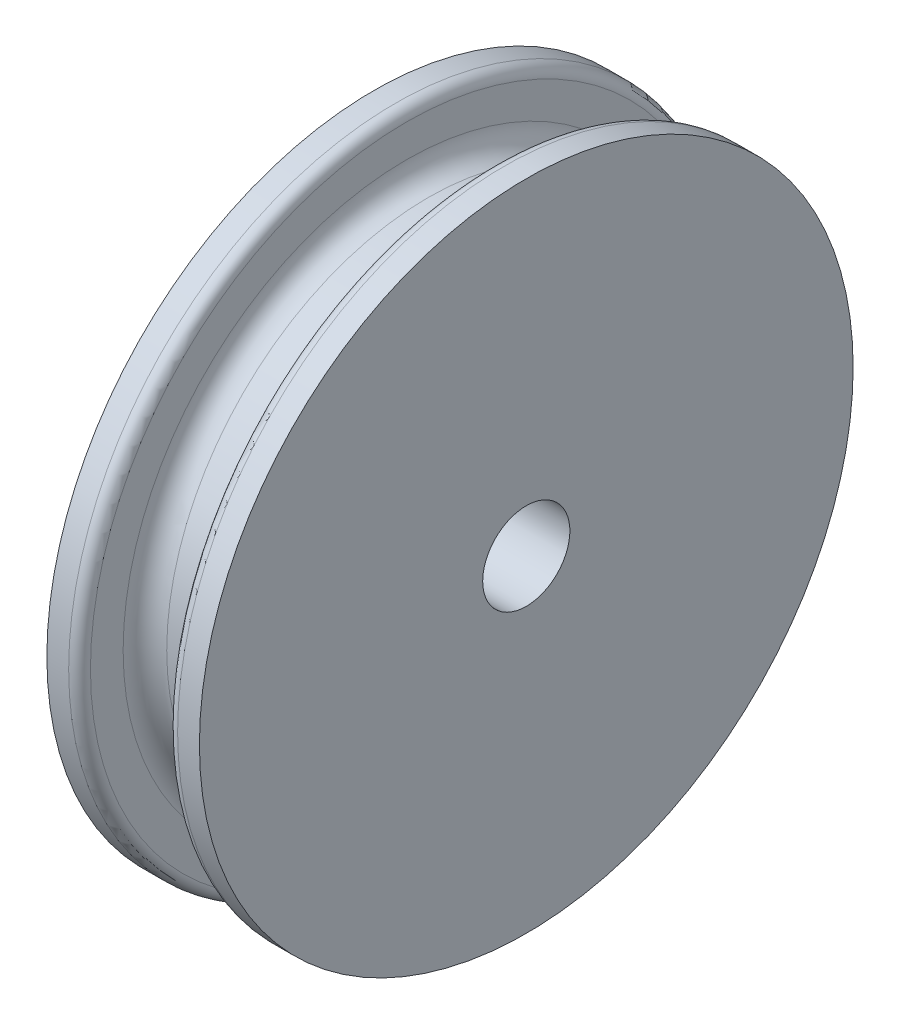
ISO-10303-21;
HEADER;
FILE_DESCRIPTION(('STEP AP214'),'2;1');
FILE_NAME('part.step','',(''),(''),'','','');
FILE_SCHEMA(('AUTOMOTIVE_DESIGN { 1 0 10303 214 1 1 1 1 }'));
ENDSEC;
DATA;
#1=APPLICATION_CONTEXT('core data for automotive mechanical design processes');
#2=APPLICATION_PROTOCOL_DEFINITION('international standard','automotive_design',2000,#1);
#3=PRODUCT_CONTEXT('',#1,'mechanical');
#4=PRODUCT('Part','Part','',(#3));
#5=PRODUCT_RELATED_PRODUCT_CATEGORY('part','',(#4));
#6=PRODUCT_DEFINITION_FORMATION('','',#4);
#7=PRODUCT_DEFINITION_CONTEXT('part definition',#1,'design');
#8=PRODUCT_DEFINITION('design','',#6,#7);
#9=PRODUCT_DEFINITION_SHAPE('','',#8);
#10=(LENGTH_UNIT() NAMED_UNIT(*) SI_UNIT(.MILLI.,.METRE.));
#11=(NAMED_UNIT(*) PLANE_ANGLE_UNIT() SI_UNIT($,.RADIAN.));
#12=(NAMED_UNIT(*) SI_UNIT($,.STERADIAN.) SOLID_ANGLE_UNIT());
#13=UNCERTAINTY_MEASURE_WITH_UNIT(LENGTH_MEASURE(1.E-05),#10,'distance_accuracy_value','');
#14=(GEOMETRIC_REPRESENTATION_CONTEXT(3) GLOBAL_UNCERTAINTY_ASSIGNED_CONTEXT((#13)) GLOBAL_UNIT_ASSIGNED_CONTEXT((#10,
#11,#12)) REPRESENTATION_CONTEXT('',''));
#15=CARTESIAN_POINT('',(0.,0.,0.));
#16=DIRECTION('',(0.,0.,1.));
#17=DIRECTION('',(1.,0.,0.));
#18=AXIS2_PLACEMENT_3D('',#15,#16,#17);
#19=CARTESIAN_POINT('',(1.75,1.,0.));
#20=DIRECTION('',(-1.,0.,0.));
#21=DIRECTION('',(0.,0.,1.));
#22=AXIS2_PLACEMENT_3D('',#19,#20,#21);
#23=PLANE('',#22);
#24=CARTESIAN_POINT('',(1.75,0.,0.));
#25=DIRECTION('',(-1.,0.,0.));
#26=DIRECTION('',(0.,0.,1.));
#27=AXIS2_PLACEMENT_3D('',#24,#25,#26);
#28=CIRCLE('',#27,7.5);
#29=CARTESIAN_POINT('',(1.75,0.,7.5));
#30=VERTEX_POINT('',#29);
#31=EDGE_CURVE('E73',#30,#30,#28,.T.);
#32=ORIENTED_EDGE('',*,*,#31,.F.);
#33=EDGE_LOOP('',(#32));
#34=FACE_BOUND('',#33,.T.);
#35=CARTESIAN_POINT('',(1.75,0.,0.));
#36=DIRECTION('',(-1.,0.,0.));
#37=DIRECTION('',(0.,0.,1.));
#38=AXIS2_PLACEMENT_3D('',#35,#36,#37);
#39=CIRCLE('',#38,1.);
#40=CARTESIAN_POINT('',(1.75,0.,1.));
#41=VERTEX_POINT('',#40);
#42=EDGE_CURVE('E52',#41,#41,#39,.T.);
#43=ORIENTED_EDGE('',*,*,#42,.T.);
#44=EDGE_LOOP('',(#43));
#45=FACE_BOUND('',#44,.T.);
#46=ADVANCED_FACE('F32',(#34,#45),#23,.F.);
#47=CARTESIAN_POINT('',(0.,0.,0.));
#48=DIRECTION('',(-1.,0.,0.));
#49=DIRECTION('',(0.,0.,1.));
#50=AXIS2_PLACEMENT_3D('',#47,#48,#49);
#51=CYLINDRICAL_SURFACE('',#50,1.);
#52=ORIENTED_EDGE('',*,*,#42,.F.);
#53=EDGE_LOOP('',(#52));
#54=FACE_BOUND('',#53,.T.);
#55=CARTESIAN_POINT('',(-1.75,0.,0.));
#56=DIRECTION('',(-1.,0.,0.));
#57=DIRECTION('',(0.,0.,1.));
#58=AXIS2_PLACEMENT_3D('',#55,#56,#57);
#59=CIRCLE('',#58,1.);
#60=CARTESIAN_POINT('',(-1.75,0.,1.));
#61=VERTEX_POINT('',#60);
#62=EDGE_CURVE('E55',#61,#61,#59,.T.);
#63=ORIENTED_EDGE('',*,*,#62,.T.);
#64=EDGE_LOOP('',(#63));
#65=FACE_BOUND('',#64,.T.);
#66=ADVANCED_FACE('F81',(#54,#65),#51,.F.);
#67=CARTESIAN_POINT('',(-1.75,1.,0.));
#68=DIRECTION('',(1.,0.,0.));
#69=DIRECTION('',(0.,0.,-1.));
#70=AXIS2_PLACEMENT_3D('',#67,#68,#69);
#71=PLANE('',#70);
#72=ORIENTED_EDGE('',*,*,#62,.F.);
#73=EDGE_LOOP('',(#72));
#74=FACE_BOUND('',#73,.T.);
#75=CARTESIAN_POINT('',(-1.75,0.,0.));
#76=DIRECTION('',(-1.,0.,0.));
#77=DIRECTION('',(0.,0.,1.));
#78=AXIS2_PLACEMENT_3D('',#75,#76,#77);
#79=CIRCLE('',#78,7.5);
#80=CARTESIAN_POINT('',(-1.75,0.,7.5));
#81=VERTEX_POINT('',#80);
#82=EDGE_CURVE('E58',#81,#81,#79,.T.);
#83=ORIENTED_EDGE('',*,*,#82,.T.);
#84=EDGE_LOOP('',(#83));
#85=FACE_BOUND('',#84,.T.);
#86=ADVANCED_FACE('F87',(#74,#85),#71,.F.);
#87=CARTESIAN_POINT('',(0.,0.,0.));
#88=DIRECTION('',(-1.,0.,0.));
#89=DIRECTION('',(0.,0.,1.));
#90=AXIS2_PLACEMENT_3D('',#87,#88,#89);
#91=CYLINDRICAL_SURFACE('',#90,7.5);
#92=CARTESIAN_POINT('',(-1.25,0.,0.));
#93=DIRECTION('',(-1.,0.,0.));
#94=DIRECTION('',(0.,0.,1.));
#95=AXIS2_PLACEMENT_3D('',#92,#93,#94);
#96=CIRCLE('',#95,7.5);
#97=CARTESIAN_POINT('',(-1.25,0.,7.5));
#98=VERTEX_POINT('',#97);
#99=EDGE_CURVE('E47',#98,#98,#96,.T.);
#100=ORIENTED_EDGE('',*,*,#99,.T.);
#101=EDGE_LOOP('',(#100));
#102=FACE_BOUND('',#101,.T.);
#103=ORIENTED_EDGE('',*,*,#82,.F.);
#104=EDGE_LOOP('',(#103));
#105=FACE_BOUND('',#104,.T.);
#106=ADVANCED_FACE('F93',(#102,#105),#91,.T.);
#107=CARTESIAN_POINT('',(-0.999999999999999,7.5,0.));
#108=DIRECTION('',(-1.,0.,0.));
#109=DIRECTION('',(0.,0.,1.));
#110=AXIS2_PLACEMENT_3D('',#107,#108,#109);
#111=PLANE('',#110);
#112=CARTESIAN_POINT('',(-0.999999999999999,0.,0.));
#113=DIRECTION('',(-1.,0.,0.));
#114=DIRECTION('',(0.,0.,1.));
#115=AXIS2_PLACEMENT_3D('',#112,#113,#114);
#116=CIRCLE('',#115,7.25);
#117=CARTESIAN_POINT('',(-0.999999999999999,0.,7.25));
#118=VERTEX_POINT('',#117);
#119=EDGE_CURVE('E43',#118,#118,#116,.F.);
#120=ORIENTED_EDGE('',*,*,#119,.T.);
#121=EDGE_LOOP('',(#120));
#122=FACE_BOUND('',#121,.T.);
#123=CARTESIAN_POINT('',(-0.999999999999999,0.,0.));
#124=DIRECTION('',(-1.,0.,0.));
#125=DIRECTION('',(0.,0.,1.));
#126=AXIS2_PLACEMENT_3D('',#123,#124,#125);
#127=CIRCLE('',#126,6.5);
#128=CARTESIAN_POINT('',(-0.999999999999999,0.,6.5));
#129=VERTEX_POINT('',#128);
#130=EDGE_CURVE('E61',#129,#129,#127,.T.);
#131=ORIENTED_EDGE('',*,*,#130,.T.);
#132=EDGE_LOOP('',(#131));
#133=FACE_BOUND('',#132,.T.);
#134=ADVANCED_FACE('F98',(#122,#133),#111,.F.);
#135=CARTESIAN_POINT('',(-0.499999999999999,0.,0.));
#136=DIRECTION('',(-1.,0.,0.));
#137=DIRECTION('',(0.,0.,1.));
#138=AXIS2_PLACEMENT_3D('',#135,#136,#137);
#139=TOROIDAL_SURFACE('',#138,6.5,0.5);
#140=ORIENTED_EDGE('',*,*,#130,.F.);
#141=EDGE_LOOP('',(#140));
#142=FACE_BOUND('',#141,.T.);
#143=CARTESIAN_POINT('',(-0.5,0.,0.));
#144=DIRECTION('',(-1.,0.,0.));
#145=DIRECTION('',(0.,0.,1.));
#146=AXIS2_PLACEMENT_3D('',#143,#144,#145);
#147=CIRCLE('',#146,6.);
#148=CARTESIAN_POINT('',(-0.5,0.,6.));
#149=VERTEX_POINT('',#148);
#150=EDGE_CURVE('E64',#149,#149,#147,.T.);
#151=ORIENTED_EDGE('',*,*,#150,.T.);
#152=EDGE_LOOP('',(#151));
#153=FACE_BOUND('',#152,.T.);
#154=ADVANCED_FACE('F104',(#142,#153),#139,.F.);
#155=CARTESIAN_POINT('',(0.,0.,0.));
#156=DIRECTION('',(-1.,0.,0.));
#157=DIRECTION('',(0.,0.,1.));
#158=AXIS2_PLACEMENT_3D('',#155,#156,#157);
#159=CYLINDRICAL_SURFACE('',#158,6.);
#160=ORIENTED_EDGE('',*,*,#150,.F.);
#161=EDGE_LOOP('',(#160));
#162=FACE_BOUND('',#161,.T.);
#163=CARTESIAN_POINT('',(0.499999999999999,0.,0.));
#164=DIRECTION('',(-1.,0.,0.));
#165=DIRECTION('',(0.,0.,1.));
#166=AXIS2_PLACEMENT_3D('',#163,#164,#165);
#167=CIRCLE('',#166,6.);
#168=CARTESIAN_POINT('',(0.499999999999999,0.,6.));
#169=VERTEX_POINT('',#168);
#170=EDGE_CURVE('E67',#169,#169,#167,.T.);
#171=ORIENTED_EDGE('',*,*,#170,.T.);
#172=EDGE_LOOP('',(#171));
#173=FACE_BOUND('',#172,.T.);
#174=ADVANCED_FACE('F126',(#162,#173),#159,.T.);
#175=CARTESIAN_POINT('',(0.499999999999999,0.,0.));
#176=DIRECTION('',(-1.,0.,0.));
#177=DIRECTION('',(0.,0.,1.));
#178=AXIS2_PLACEMENT_3D('',#175,#176,#177);
#179=TOROIDAL_SURFACE('',#178,6.5,0.5);
#180=ORIENTED_EDGE('',*,*,#170,.F.);
#181=EDGE_LOOP('',(#180));
#182=FACE_BOUND('',#181,.T.);
#183=CARTESIAN_POINT('',(1.,0.,0.));
#184=DIRECTION('',(-1.,0.,0.));
#185=DIRECTION('',(0.,0.,1.));
#186=AXIS2_PLACEMENT_3D('',#183,#184,#185);
#187=CIRCLE('',#186,6.5);
#188=CARTESIAN_POINT('',(1.,0.,6.5));
#189=VERTEX_POINT('',#188);
#190=EDGE_CURVE('E70',#189,#189,#187,.T.);
#191=ORIENTED_EDGE('',*,*,#190,.T.);
#192=EDGE_LOOP('',(#191));
#193=FACE_BOUND('',#192,.T.);
#194=ADVANCED_FACE('F131',(#182,#193),#179,.F.);
#195=CARTESIAN_POINT('',(0.999999999999999,7.5,0.));
#196=DIRECTION('',(1.,0.,0.));
#197=DIRECTION('',(0.,0.,-1.));
#198=AXIS2_PLACEMENT_3D('',#195,#196,#197);
#199=PLANE('',#198);
#200=CARTESIAN_POINT('',(0.999999999999999,0.,0.));
#201=DIRECTION('',(1.,0.,0.));
#202=DIRECTION('',(0.,0.,-1.));
#203=AXIS2_PLACEMENT_3D('',#200,#201,#202);
#204=CIRCLE('',#203,7.25);
#205=CARTESIAN_POINT('',(0.999999999999999,0.,-7.25));
#206=VERTEX_POINT('',#205);
#207=EDGE_CURVE('E39',#206,#206,#204,.F.);
#208=ORIENTED_EDGE('',*,*,#207,.T.);
#209=EDGE_LOOP('',(#208));
#210=FACE_BOUND('',#209,.T.);
#211=ORIENTED_EDGE('',*,*,#190,.F.);
#212=EDGE_LOOP('',(#211));
#213=FACE_BOUND('',#212,.T.);
#214=ADVANCED_FACE('F116',(#210,#213),#199,.F.);
#215=CARTESIAN_POINT('',(0.,0.,0.));
#216=DIRECTION('',(-1.,0.,0.));
#217=DIRECTION('',(0.,0.,1.));
#218=AXIS2_PLACEMENT_3D('',#215,#216,#217);
#219=CYLINDRICAL_SURFACE('',#218,7.5);
#220=CARTESIAN_POINT('',(1.25,0.,0.));
#221=DIRECTION('',(1.,0.,0.));
#222=DIRECTION('',(0.,0.,-1.));
#223=AXIS2_PLACEMENT_3D('',#220,#221,#222);
#224=CIRCLE('',#223,7.5);
#225=CARTESIAN_POINT('',(1.25,0.,-7.5));
#226=VERTEX_POINT('',#225);
#227=EDGE_CURVE('E10',#226,#226,#224,.T.);
#228=ORIENTED_EDGE('',*,*,#227,.T.);
#229=EDGE_LOOP('',(#228));
#230=FACE_BOUND('',#229,.T.);
#231=ORIENTED_EDGE('',*,*,#31,.T.);
#232=EDGE_LOOP('',(#231));
#233=FACE_BOUND('',#232,.T.);
#234=ADVANCED_FACE('F77',(#230,#233),#219,.T.);
#235=CARTESIAN_POINT('',(-1.25,0.,0.));
#236=DIRECTION('',(-1.,0.,0.));
#237=DIRECTION('',(0.,0.,1.));
#238=AXIS2_PLACEMENT_3D('',#235,#236,#237);
#239=TOROIDAL_SURFACE('',#238,7.25,0.25);
#240=ORIENTED_EDGE('',*,*,#119,.F.);
#241=EDGE_LOOP('',(#240));
#242=FACE_BOUND('',#241,.T.);
#243=ORIENTED_EDGE('',*,*,#99,.F.);
#244=EDGE_LOOP('',(#243));
#245=FACE_BOUND('',#244,.T.);
#246=ADVANCED_FACE('F108',(#242,#245),#239,.T.);
#247=CARTESIAN_POINT('',(1.25,0.,0.));
#248=DIRECTION('',(1.,0.,0.));
#249=DIRECTION('',(0.,0.,-1.));
#250=AXIS2_PLACEMENT_3D('',#247,#248,#249);
#251=TOROIDAL_SURFACE('',#250,7.25,0.25);
#252=ORIENTED_EDGE('',*,*,#227,.F.);
#253=EDGE_LOOP('',(#252));
#254=FACE_BOUND('',#253,.T.);
#255=ORIENTED_EDGE('',*,*,#207,.F.);
#256=EDGE_LOOP('',(#255));
#257=FACE_BOUND('',#256,.T.);
#258=ADVANCED_FACE('F34',(#254,#257),#251,.T.);
#259=CLOSED_SHELL('',(#46,#66,#86,#106,#134,#154,#174,#194,#214,#234,#246,#258));
#260=MANIFOLD_SOLID_BREP('B2',#259);
#261=ADVANCED_BREP_SHAPE_REPRESENTATION('',(#18,#260),#14);
#262=SHAPE_DEFINITION_REPRESENTATION(#9,#261);
ENDSEC;
END-ISO-10303-21;
